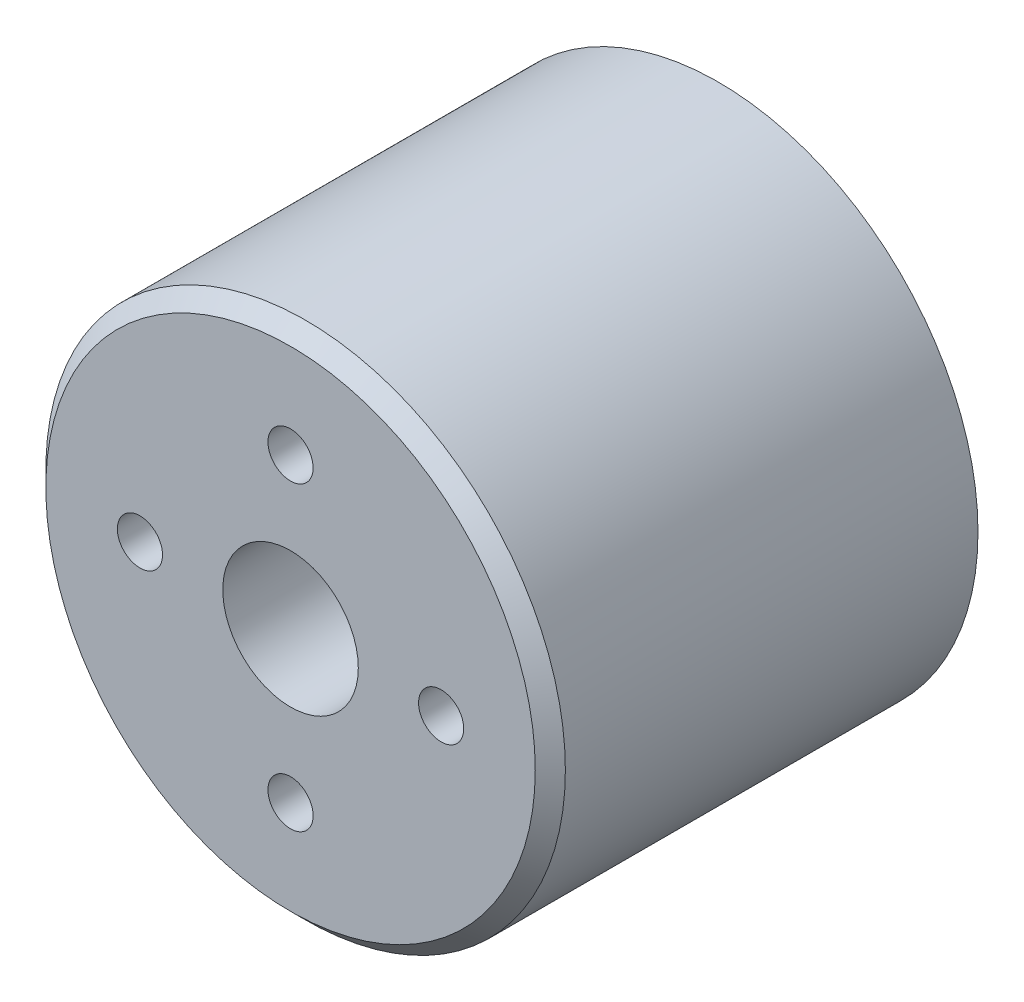
ISO-10303-21;
HEADER;
FILE_DESCRIPTION(('STEP AP214'),'2;1');
FILE_NAME('part.step','',(''),(''),'','','');
FILE_SCHEMA(('AUTOMOTIVE_DESIGN { 1 0 10303 214 1 1 1 1 }'));
ENDSEC;
DATA;
#1=APPLICATION_CONTEXT('core data for automotive mechanical design processes');
#2=APPLICATION_PROTOCOL_DEFINITION('international standard','automotive_design',2000,#1);
#3=PRODUCT_CONTEXT('',#1,'mechanical');
#4=PRODUCT('Part','Part','',(#3));
#5=PRODUCT_RELATED_PRODUCT_CATEGORY('part','',(#4));
#6=PRODUCT_DEFINITION_FORMATION('','',#4);
#7=PRODUCT_DEFINITION_CONTEXT('part definition',#1,'design');
#8=PRODUCT_DEFINITION('design','',#6,#7);
#9=PRODUCT_DEFINITION_SHAPE('','',#8);
#10=(LENGTH_UNIT() NAMED_UNIT(*) SI_UNIT(.MILLI.,.METRE.));
#11=(NAMED_UNIT(*) PLANE_ANGLE_UNIT() SI_UNIT($,.RADIAN.));
#12=(NAMED_UNIT(*) SI_UNIT($,.STERADIAN.) SOLID_ANGLE_UNIT());
#13=UNCERTAINTY_MEASURE_WITH_UNIT(LENGTH_MEASURE(1.E-05),#10,'distance_accuracy_value','');
#14=(GEOMETRIC_REPRESENTATION_CONTEXT(3) GLOBAL_UNCERTAINTY_ASSIGNED_CONTEXT((#13)) GLOBAL_UNIT_ASSIGNED_CONTEXT((#10,
#11,#12)) REPRESENTATION_CONTEXT('',''));
#15=CARTESIAN_POINT('',(0.,0.,0.));
#16=DIRECTION('',(0.,0.,1.));
#17=DIRECTION('',(1.,0.,0.));
#18=AXIS2_PLACEMENT_3D('',#15,#16,#17);
#19=CARTESIAN_POINT('',(0.,0.,28.4));
#20=DIRECTION('',(0.,0.,-1.));
#21=DIRECTION('',(-1.,0.,0.));
#22=AXIS2_PLACEMENT_3D('',#19,#20,#21);
#23=CYLINDRICAL_SURFACE('',#22,17.25);
#24=CARTESIAN_POINT('',(0.,0.,27.4));
#25=DIRECTION('',(0.,0.,1.));
#26=DIRECTION('',(1.,0.,0.));
#27=AXIS2_PLACEMENT_3D('',#24,#25,#26);
#28=CIRCLE('',#27,17.25);
#29=CARTESIAN_POINT('',(17.25,0.,27.4));
#30=VERTEX_POINT('',#29);
#31=EDGE_CURVE('E10',#30,#30,#28,.F.);
#32=ORIENTED_EDGE('',*,*,#31,.T.);
#33=EDGE_LOOP('',(#32));
#34=FACE_BOUND('',#33,.T.);
#35=CARTESIAN_POINT('',(0.,0.,0.));
#36=DIRECTION('',(0.,0.,1.));
#37=DIRECTION('',(1.,0.,0.));
#38=AXIS2_PLACEMENT_3D('',#35,#36,#37);
#39=CIRCLE('',#38,17.25);
#40=CARTESIAN_POINT('',(17.25,0.,0.));
#41=VERTEX_POINT('',#40);
#42=EDGE_CURVE('E45',#41,#41,#39,.T.);
#43=ORIENTED_EDGE('',*,*,#42,.T.);
#44=EDGE_LOOP('',(#43));
#45=FACE_BOUND('',#44,.T.);
#46=ADVANCED_FACE('F33',(#34,#45),#23,.T.);
#47=CARTESIAN_POINT('',(0.,0.,28.4));
#48=DIRECTION('',(0.,0.,1.));
#49=DIRECTION('',(1.,0.,0.));
#50=AXIS2_PLACEMENT_3D('',#47,#48,#49);
#51=PLANE('',#50);
#52=CARTESIAN_POINT('',(0.,0.,28.4));
#53=DIRECTION('',(0.,0.,1.));
#54=DIRECTION('',(1.,0.,0.));
#55=AXIS2_PLACEMENT_3D('',#52,#53,#54);
#56=CIRCLE('',#55,4.5);
#57=CARTESIAN_POINT('',(4.5,0.,28.4));
#58=VERTEX_POINT('',#57);
#59=EDGE_CURVE('E112',#58,#58,#56,.T.);
#60=ORIENTED_EDGE('',*,*,#59,.F.);
#61=EDGE_LOOP('',(#60));
#62=FACE_BOUND('',#61,.T.);
#63=CARTESIAN_POINT('',(0.,10.,28.4));
#64=DIRECTION('',(0.,0.,1.));
#65=DIRECTION('',(1.,0.,0.));
#66=AXIS2_PLACEMENT_3D('',#63,#64,#65);
#67=CIRCLE('',#66,1.5);
#68=CARTESIAN_POINT('',(1.5,10.,28.4));
#69=VERTEX_POINT('',#68);
#70=EDGE_CURVE('E107',#69,#69,#67,.T.);
#71=ORIENTED_EDGE('',*,*,#70,.F.);
#72=EDGE_LOOP('',(#71));
#73=FACE_BOUND('',#72,.T.);
#74=CARTESIAN_POINT('',(10.,0.,28.4));
#75=DIRECTION('',(0.,0.,1.));
#76=DIRECTION('',(1.,0.,0.));
#77=AXIS2_PLACEMENT_3D('',#74,#75,#76);
#78=CIRCLE('',#77,1.5);
#79=CARTESIAN_POINT('',(11.5,0.,28.4));
#80=VERTEX_POINT('',#79);
#81=EDGE_CURVE('E101',#80,#80,#78,.T.);
#82=ORIENTED_EDGE('',*,*,#81,.F.);
#83=EDGE_LOOP('',(#82));
#84=FACE_BOUND('',#83,.T.);
#85=CARTESIAN_POINT('',(0.,-10.,28.4));
#86=DIRECTION('',(0.,0.,1.));
#87=DIRECTION('',(1.,0.,0.));
#88=AXIS2_PLACEMENT_3D('',#85,#86,#87);
#89=CIRCLE('',#88,1.5);
#90=CARTESIAN_POINT('',(1.5,-10.,28.4));
#91=VERTEX_POINT('',#90);
#92=EDGE_CURVE('E95',#91,#91,#89,.T.);
#93=ORIENTED_EDGE('',*,*,#92,.F.);
#94=EDGE_LOOP('',(#93));
#95=FACE_BOUND('',#94,.T.);
#96=CARTESIAN_POINT('',(-10.,0.,28.4));
#97=DIRECTION('',(0.,0.,1.));
#98=DIRECTION('',(1.,0.,0.));
#99=AXIS2_PLACEMENT_3D('',#96,#97,#98);
#100=CIRCLE('',#99,1.5);
#101=CARTESIAN_POINT('',(-8.5,0.,28.4));
#102=VERTEX_POINT('',#101);
#103=EDGE_CURVE('E88',#102,#102,#100,.T.);
#104=ORIENTED_EDGE('',*,*,#103,.F.);
#105=EDGE_LOOP('',(#104));
#106=FACE_BOUND('',#105,.T.);
#107=CARTESIAN_POINT('',(0.,0.,28.4));
#108=DIRECTION('',(0.,0.,1.));
#109=DIRECTION('',(1.,0.,0.));
#110=AXIS2_PLACEMENT_3D('',#107,#108,#109);
#111=CIRCLE('',#110,16.25);
#112=CARTESIAN_POINT('',(16.25,0.,28.4));
#113=VERTEX_POINT('',#112);
#114=EDGE_CURVE('E41',#113,#113,#111,.T.);
#115=ORIENTED_EDGE('',*,*,#114,.T.);
#116=EDGE_LOOP('',(#115));
#117=FACE_BOUND('',#116,.T.);
#118=ADVANCED_FACE('F128',(#62,#73,#84,#95,#106,#117),#51,.T.);
#119=CARTESIAN_POINT('',(0.,0.,0.));
#120=DIRECTION('',(0.,0.,1.));
#121=DIRECTION('',(1.,0.,0.));
#122=AXIS2_PLACEMENT_3D('',#119,#120,#121);
#123=PLANE('',#122);
#124=CARTESIAN_POINT('',(0.,0.,0.));
#125=DIRECTION('',(0.,0.,1.));
#126=DIRECTION('',(1.,0.,0.));
#127=AXIS2_PLACEMENT_3D('',#124,#125,#126);
#128=CIRCLE('',#127,4.5);
#129=CARTESIAN_POINT('',(4.5,0.,0.));
#130=VERTEX_POINT('',#129);
#131=EDGE_CURVE('E92',#130,#130,#128,.T.);
#132=ORIENTED_EDGE('',*,*,#131,.T.);
#133=EDGE_LOOP('',(#132));
#134=FACE_BOUND('',#133,.T.);
#135=CARTESIAN_POINT('',(15.4264468641829,0.,0.));
#136=DIRECTION('',(0.,0.,-1.));
#137=DIRECTION('',(-1.,0.,0.));
#138=AXIS2_PLACEMENT_3D('',#135,#136,#137);
#139=CIRCLE('',#138,1.25);
#140=CARTESIAN_POINT('',(14.1764468641829,0.,0.));
#141=VERTEX_POINT('',#140);
#142=EDGE_CURVE('E58',#141,#141,#139,.T.);
#143=ORIENTED_EDGE('',*,*,#142,.F.);
#144=EDGE_LOOP('',(#143));
#145=FACE_BOUND('',#144,.T.);
#146=CARTESIAN_POINT('',(-7.71322343209146,-13.3596948745132,0.));
#147=DIRECTION('',(0.,0.,-1.));
#148=DIRECTION('',(-1.,0.,0.));
#149=AXIS2_PLACEMENT_3D('',#146,#147,#148);
#150=CIRCLE('',#149,1.25);
#151=CARTESIAN_POINT('',(-8.96322343209146,-13.3596948745132,0.));
#152=VERTEX_POINT('',#151);
#153=EDGE_CURVE('E65',#152,#152,#150,.T.);
#154=ORIENTED_EDGE('',*,*,#153,.F.);
#155=EDGE_LOOP('',(#154));
#156=FACE_BOUND('',#155,.T.);
#157=CARTESIAN_POINT('',(-7.71322343209146,13.3596948745132,0.));
#158=DIRECTION('',(0.,0.,-1.));
#159=DIRECTION('',(-1.,0.,0.));
#160=AXIS2_PLACEMENT_3D('',#157,#158,#159);
#161=CIRCLE('',#160,1.25);
#162=CARTESIAN_POINT('',(-8.96322343209146,13.3596948745132,0.));
#163=VERTEX_POINT('',#162);
#164=EDGE_CURVE('E71',#163,#163,#161,.T.);
#165=ORIENTED_EDGE('',*,*,#164,.F.);
#166=EDGE_LOOP('',(#165));
#167=FACE_BOUND('',#166,.T.);
#168=CARTESIAN_POINT('',(8.6602540378444,5.00000000000001,0.));
#169=DIRECTION('',(0.,0.,-1.));
#170=DIRECTION('',(-1.,0.,0.));
#171=AXIS2_PLACEMENT_3D('',#168,#169,#170);
#172=CIRCLE('',#171,1.5);
#173=CARTESIAN_POINT('',(7.1602540378444,5.00000000000001,0.));
#174=VERTEX_POINT('',#173);
#175=EDGE_CURVE('E77',#174,#174,#172,.T.);
#176=ORIENTED_EDGE('',*,*,#175,.F.);
#177=EDGE_LOOP('',(#176));
#178=FACE_BOUND('',#177,.T.);
#179=CARTESIAN_POINT('',(0.,-10.,0.));
#180=DIRECTION('',(0.,0.,-1.));
#181=DIRECTION('',(-1.,0.,0.));
#182=AXIS2_PLACEMENT_3D('',#179,#180,#181);
#183=CIRCLE('',#182,1.5);
#184=CARTESIAN_POINT('',(-1.5,-10.,0.));
#185=VERTEX_POINT('',#184);
#186=EDGE_CURVE('E83',#185,#185,#183,.T.);
#187=ORIENTED_EDGE('',*,*,#186,.F.);
#188=EDGE_LOOP('',(#187));
#189=FACE_BOUND('',#188,.T.);
#190=CARTESIAN_POINT('',(-8.6602540378444,5.00000000000001,0.));
#191=DIRECTION('',(0.,0.,-1.));
#192=DIRECTION('',(-1.,0.,0.));
#193=AXIS2_PLACEMENT_3D('',#190,#191,#192);
#194=CIRCLE('',#193,1.5);
#195=CARTESIAN_POINT('',(-10.1602540378444,5.00000000000001,0.));
#196=VERTEX_POINT('',#195);
#197=EDGE_CURVE('E52',#196,#196,#194,.T.);
#198=ORIENTED_EDGE('',*,*,#197,.F.);
#199=EDGE_LOOP('',(#198));
#200=FACE_BOUND('',#199,.T.);
#201=ORIENTED_EDGE('',*,*,#42,.F.);
#202=EDGE_LOOP('',(#201));
#203=FACE_BOUND('',#202,.T.);
#204=ADVANCED_FACE('F118',(#134,#145,#156,#167,#178,#189,#200,#203),#123,.F.);
#205=CARTESIAN_POINT('',(0.,0.,28.4));
#206=DIRECTION('',(0.,0.,-1.));
#207=DIRECTION('',(-1.,0.,0.));
#208=AXIS2_PLACEMENT_3D('',#205,#206,#207);
#209=CONICAL_SURFACE('',#208,16.25,0.785398163397452);
#210=ORIENTED_EDGE('',*,*,#31,.F.);
#211=EDGE_LOOP('',(#210));
#212=FACE_BOUND('',#211,.T.);
#213=ORIENTED_EDGE('',*,*,#114,.F.);
#214=EDGE_LOOP('',(#213));
#215=FACE_BOUND('',#214,.T.);
#216=ADVANCED_FACE('F36',(#212,#215),#209,.T.);
#217=CARTESIAN_POINT('',(-8.6602540378444,5.00000000000001,3.));
#218=DIRECTION('',(0.,0.,-1.));
#219=DIRECTION('',(-1.,0.,0.));
#220=AXIS2_PLACEMENT_3D('',#217,#218,#219);
#221=CYLINDRICAL_SURFACE('',#220,1.5);
#222=CARTESIAN_POINT('',(-8.6602540378444,5.00000000000001,3.));
#223=DIRECTION('',(0.,0.,-1.));
#224=DIRECTION('',(-1.,0.,0.));
#225=AXIS2_PLACEMENT_3D('',#222,#223,#224);
#226=CIRCLE('',#225,1.5);
#227=CARTESIAN_POINT('',(-10.1602540378444,5.00000000000001,3.));
#228=VERTEX_POINT('',#227);
#229=EDGE_CURVE('E49',#228,#228,#226,.T.);
#230=ORIENTED_EDGE('',*,*,#229,.F.);
#231=EDGE_LOOP('',(#230));
#232=FACE_BOUND('',#231,.T.);
#233=ORIENTED_EDGE('',*,*,#197,.T.);
#234=EDGE_LOOP('',(#233));
#235=FACE_BOUND('',#234,.T.);
#236=ADVANCED_FACE('F165',(#232,#235),#221,.F.);
#237=CARTESIAN_POINT('',(-8.6602540378444,5.00000000000001,3.));
#238=DIRECTION('',(0.,0.,-1.));
#239=DIRECTION('',(-1.,0.,0.));
#240=AXIS2_PLACEMENT_3D('',#237,#238,#239);
#241=PLANE('',#240);
#242=ORIENTED_EDGE('',*,*,#229,.T.);
#243=EDGE_LOOP('',(#242));
#244=FACE_BOUND('',#243,.T.);
#245=ADVANCED_FACE('F168',(#244),#241,.T.);
#246=CARTESIAN_POINT('',(0.,-10.,3.));
#247=DIRECTION('',(0.,0.,-1.));
#248=DIRECTION('',(-1.,0.,0.));
#249=AXIS2_PLACEMENT_3D('',#246,#247,#248);
#250=CYLINDRICAL_SURFACE('',#249,1.5);
#251=CARTESIAN_POINT('',(0.,-10.,3.));
#252=DIRECTION('',(0.,0.,-1.));
#253=DIRECTION('',(-1.,0.,0.));
#254=AXIS2_PLACEMENT_3D('',#251,#252,#253);
#255=CIRCLE('',#254,1.5);
#256=CARTESIAN_POINT('',(-1.5,-10.,3.));
#257=VERTEX_POINT('',#256);
#258=EDGE_CURVE('E55',#257,#257,#255,.T.);
#259=ORIENTED_EDGE('',*,*,#258,.F.);
#260=EDGE_LOOP('',(#259));
#261=FACE_BOUND('',#260,.T.);
#262=ORIENTED_EDGE('',*,*,#186,.T.);
#263=EDGE_LOOP('',(#262));
#264=FACE_BOUND('',#263,.T.);
#265=ADVANCED_FACE('F172',(#261,#264),#250,.F.);
#266=CARTESIAN_POINT('',(0.,-10.,3.));
#267=DIRECTION('',(0.,0.,-1.));
#268=DIRECTION('',(-1.,0.,0.));
#269=AXIS2_PLACEMENT_3D('',#266,#267,#268);
#270=PLANE('',#269);
#271=ORIENTED_EDGE('',*,*,#258,.T.);
#272=EDGE_LOOP('',(#271));
#273=FACE_BOUND('',#272,.T.);
#274=ADVANCED_FACE('F197',(#273),#270,.T.);
#275=CARTESIAN_POINT('',(8.6602540378444,5.00000000000001,3.));
#276=DIRECTION('',(0.,0.,-1.));
#277=DIRECTION('',(-1.,0.,0.));
#278=AXIS2_PLACEMENT_3D('',#275,#276,#277);
#279=CYLINDRICAL_SURFACE('',#278,1.5);
#280=CARTESIAN_POINT('',(8.6602540378444,5.00000000000001,3.));
#281=DIRECTION('',(0.,0.,-1.));
#282=DIRECTION('',(-1.,0.,0.));
#283=AXIS2_PLACEMENT_3D('',#280,#281,#282);
#284=CIRCLE('',#283,1.5);
#285=CARTESIAN_POINT('',(7.1602540378444,5.00000000000001,3.));
#286=VERTEX_POINT('',#285);
#287=EDGE_CURVE('E80',#286,#286,#284,.T.);
#288=ORIENTED_EDGE('',*,*,#287,.F.);
#289=EDGE_LOOP('',(#288));
#290=FACE_BOUND('',#289,.T.);
#291=ORIENTED_EDGE('',*,*,#175,.T.);
#292=EDGE_LOOP('',(#291));
#293=FACE_BOUND('',#292,.T.);
#294=ADVANCED_FACE('F194',(#290,#293),#279,.F.);
#295=CARTESIAN_POINT('',(8.6602540378444,5.00000000000001,3.));
#296=DIRECTION('',(0.,0.,-1.));
#297=DIRECTION('',(-1.,0.,0.));
#298=AXIS2_PLACEMENT_3D('',#295,#296,#297);
#299=PLANE('',#298);
#300=ORIENTED_EDGE('',*,*,#287,.T.);
#301=EDGE_LOOP('',(#300));
#302=FACE_BOUND('',#301,.T.);
#303=ADVANCED_FACE('F189',(#302),#299,.T.);
#304=CARTESIAN_POINT('',(-7.71322343209146,13.3596948745132,3.));
#305=DIRECTION('',(0.,0.,-1.));
#306=DIRECTION('',(-1.,0.,0.));
#307=AXIS2_PLACEMENT_3D('',#304,#305,#306);
#308=CYLINDRICAL_SURFACE('',#307,1.25);
#309=CARTESIAN_POINT('',(-7.71322343209146,13.3596948745132,3.));
#310=DIRECTION('',(0.,0.,-1.));
#311=DIRECTION('',(-1.,0.,0.));
#312=AXIS2_PLACEMENT_3D('',#309,#310,#311);
#313=CIRCLE('',#312,1.25);
#314=CARTESIAN_POINT('',(-8.96322343209146,13.3596948745132,3.));
#315=VERTEX_POINT('',#314);
#316=EDGE_CURVE('E74',#315,#315,#313,.T.);
#317=ORIENTED_EDGE('',*,*,#316,.F.);
#318=EDGE_LOOP('',(#317));
#319=FACE_BOUND('',#318,.T.);
#320=ORIENTED_EDGE('',*,*,#164,.T.);
#321=EDGE_LOOP('',(#320));
#322=FACE_BOUND('',#321,.T.);
#323=ADVANCED_FACE('F186',(#319,#322),#308,.F.);
#324=CARTESIAN_POINT('',(-7.71322343209146,13.3596948745132,3.));
#325=DIRECTION('',(0.,0.,-1.));
#326=DIRECTION('',(-1.,0.,0.));
#327=AXIS2_PLACEMENT_3D('',#324,#325,#326);
#328=PLANE('',#327);
#329=ORIENTED_EDGE('',*,*,#316,.T.);
#330=EDGE_LOOP('',(#329));
#331=FACE_BOUND('',#330,.T.);
#332=ADVANCED_FACE('F181',(#331),#328,.T.);
#333=CARTESIAN_POINT('',(-7.71322343209146,-13.3596948745132,3.));
#334=DIRECTION('',(0.,0.,-1.));
#335=DIRECTION('',(-1.,0.,0.));
#336=AXIS2_PLACEMENT_3D('',#333,#334,#335);
#337=CYLINDRICAL_SURFACE('',#336,1.25);
#338=CARTESIAN_POINT('',(-7.71322343209146,-13.3596948745132,3.));
#339=DIRECTION('',(0.,0.,-1.));
#340=DIRECTION('',(-1.,0.,0.));
#341=AXIS2_PLACEMENT_3D('',#338,#339,#340);
#342=CIRCLE('',#341,1.25);
#343=CARTESIAN_POINT('',(-8.96322343209146,-13.3596948745132,3.));
#344=VERTEX_POINT('',#343);
#345=EDGE_CURVE('E68',#344,#344,#342,.T.);
#346=ORIENTED_EDGE('',*,*,#345,.F.);
#347=EDGE_LOOP('',(#346));
#348=FACE_BOUND('',#347,.T.);
#349=ORIENTED_EDGE('',*,*,#153,.T.);
#350=EDGE_LOOP('',(#349));
#351=FACE_BOUND('',#350,.T.);
#352=ADVANCED_FACE('F178',(#348,#351),#337,.F.);
#353=CARTESIAN_POINT('',(-7.71322343209146,-13.3596948745132,3.));
#354=DIRECTION('',(0.,0.,-1.));
#355=DIRECTION('',(-1.,0.,0.));
#356=AXIS2_PLACEMENT_3D('',#353,#354,#355);
#357=PLANE('',#356);
#358=ORIENTED_EDGE('',*,*,#345,.T.);
#359=EDGE_LOOP('',(#358));
#360=FACE_BOUND('',#359,.T.);
#361=ADVANCED_FACE('F175',(#360),#357,.T.);
#362=CARTESIAN_POINT('',(15.4264468641829,0.,3.));
#363=DIRECTION('',(0.,0.,-1.));
#364=DIRECTION('',(-1.,0.,0.));
#365=AXIS2_PLACEMENT_3D('',#362,#363,#364);
#366=CYLINDRICAL_SURFACE('',#365,1.25);
#367=CARTESIAN_POINT('',(15.4264468641829,0.,3.));
#368=DIRECTION('',(0.,0.,-1.));
#369=DIRECTION('',(-1.,0.,0.));
#370=AXIS2_PLACEMENT_3D('',#367,#368,#369);
#371=CIRCLE('',#370,1.25);
#372=CARTESIAN_POINT('',(14.1764468641829,0.,3.));
#373=VERTEX_POINT('',#372);
#374=EDGE_CURVE('E61',#373,#373,#371,.T.);
#375=ORIENTED_EDGE('',*,*,#374,.F.);
#376=EDGE_LOOP('',(#375));
#377=FACE_BOUND('',#376,.T.);
#378=ORIENTED_EDGE('',*,*,#142,.T.);
#379=EDGE_LOOP('',(#378));
#380=FACE_BOUND('',#379,.T.);
#381=ADVANCED_FACE('F153',(#377,#380),#366,.F.);
#382=CARTESIAN_POINT('',(15.4264468641829,0.,3.));
#383=DIRECTION('',(0.,0.,-1.));
#384=DIRECTION('',(-1.,0.,0.));
#385=AXIS2_PLACEMENT_3D('',#382,#383,#384);
#386=PLANE('',#385);
#387=ORIENTED_EDGE('',*,*,#374,.T.);
#388=EDGE_LOOP('',(#387));
#389=FACE_BOUND('',#388,.T.);
#390=ADVANCED_FACE('F143',(#389),#386,.T.);
#391=CARTESIAN_POINT('',(-10.,0.,25.9));
#392=DIRECTION('',(0.,0.,1.));
#393=DIRECTION('',(1.,0.,0.));
#394=AXIS2_PLACEMENT_3D('',#391,#392,#393);
#395=CYLINDRICAL_SURFACE('',#394,1.5);
#396=CARTESIAN_POINT('',(-10.,0.,25.9));
#397=DIRECTION('',(0.,0.,1.));
#398=DIRECTION('',(1.,0.,0.));
#399=AXIS2_PLACEMENT_3D('',#396,#397,#398);
#400=CIRCLE('',#399,1.5);
#401=CARTESIAN_POINT('',(-8.5,0.,25.9));
#402=VERTEX_POINT('',#401);
#403=EDGE_CURVE('E91',#402,#402,#400,.T.);
#404=ORIENTED_EDGE('',*,*,#403,.F.);
#405=EDGE_LOOP('',(#404));
#406=FACE_BOUND('',#405,.T.);
#407=ORIENTED_EDGE('',*,*,#103,.T.);
#408=EDGE_LOOP('',(#407));
#409=FACE_BOUND('',#408,.T.);
#410=ADVANCED_FACE('F140',(#406,#409),#395,.F.);
#411=CARTESIAN_POINT('',(-10.,0.,25.9));
#412=DIRECTION('',(0.,0.,1.));
#413=DIRECTION('',(1.,0.,0.));
#414=AXIS2_PLACEMENT_3D('',#411,#412,#413);
#415=PLANE('',#414);
#416=ORIENTED_EDGE('',*,*,#403,.T.);
#417=EDGE_LOOP('',(#416));
#418=FACE_BOUND('',#417,.T.);
#419=ADVANCED_FACE('F142',(#418),#415,.T.);
#420=CARTESIAN_POINT('',(0.,-10.,25.9));
#421=DIRECTION('',(0.,0.,1.));
#422=DIRECTION('',(1.,0.,0.));
#423=AXIS2_PLACEMENT_3D('',#420,#421,#422);
#424=CYLINDRICAL_SURFACE('',#423,1.5);
#425=CARTESIAN_POINT('',(0.,-10.,25.9));
#426=DIRECTION('',(0.,0.,1.));
#427=DIRECTION('',(1.,0.,0.));
#428=AXIS2_PLACEMENT_3D('',#425,#426,#427);
#429=CIRCLE('',#428,1.5);
#430=CARTESIAN_POINT('',(1.5,-10.,25.9));
#431=VERTEX_POINT('',#430);
#432=EDGE_CURVE('E98',#431,#431,#429,.T.);
#433=ORIENTED_EDGE('',*,*,#432,.F.);
#434=EDGE_LOOP('',(#433));
#435=FACE_BOUND('',#434,.T.);
#436=ORIENTED_EDGE('',*,*,#92,.T.);
#437=EDGE_LOOP('',(#436));
#438=FACE_BOUND('',#437,.T.);
#439=ADVANCED_FACE('F150',(#435,#438),#424,.F.);
#440=CARTESIAN_POINT('',(0.,-10.,25.9));
#441=DIRECTION('',(0.,0.,1.));
#442=DIRECTION('',(1.,0.,0.));
#443=AXIS2_PLACEMENT_3D('',#440,#441,#442);
#444=PLANE('',#443);
#445=ORIENTED_EDGE('',*,*,#432,.T.);
#446=EDGE_LOOP('',(#445));
#447=FACE_BOUND('',#446,.T.);
#448=ADVANCED_FACE('F270',(#447),#444,.T.);
#449=CARTESIAN_POINT('',(10.,0.,25.9));
#450=DIRECTION('',(0.,0.,1.));
#451=DIRECTION('',(1.,0.,0.));
#452=AXIS2_PLACEMENT_3D('',#449,#450,#451);
#453=CYLINDRICAL_SURFACE('',#452,1.5);
#454=CARTESIAN_POINT('',(10.,0.,25.9));
#455=DIRECTION('',(0.,0.,1.));
#456=DIRECTION('',(1.,0.,0.));
#457=AXIS2_PLACEMENT_3D('',#454,#455,#456);
#458=CIRCLE('',#457,1.5);
#459=CARTESIAN_POINT('',(11.5,0.,25.9));
#460=VERTEX_POINT('',#459);
#461=EDGE_CURVE('E104',#460,#460,#458,.T.);
#462=ORIENTED_EDGE('',*,*,#461,.F.);
#463=EDGE_LOOP('',(#462));
#464=FACE_BOUND('',#463,.T.);
#465=ORIENTED_EDGE('',*,*,#81,.T.);
#466=EDGE_LOOP('',(#465));
#467=FACE_BOUND('',#466,.T.);
#468=ADVANCED_FACE('F280',(#464,#467),#453,.F.);
#469=CARTESIAN_POINT('',(10.,0.,25.9));
#470=DIRECTION('',(0.,0.,1.));
#471=DIRECTION('',(1.,0.,0.));
#472=AXIS2_PLACEMENT_3D('',#469,#470,#471);
#473=PLANE('',#472);
#474=ORIENTED_EDGE('',*,*,#461,.T.);
#475=EDGE_LOOP('',(#474));
#476=FACE_BOUND('',#475,.T.);
#477=ADVANCED_FACE('F290',(#476),#473,.T.);
#478=CARTESIAN_POINT('',(0.,10.,25.9));
#479=DIRECTION('',(0.,0.,1.));
#480=DIRECTION('',(1.,0.,0.));
#481=AXIS2_PLACEMENT_3D('',#478,#479,#480);
#482=CYLINDRICAL_SURFACE('',#481,1.5);
#483=CARTESIAN_POINT('',(0.,10.,25.9));
#484=DIRECTION('',(0.,0.,1.));
#485=DIRECTION('',(1.,0.,0.));
#486=AXIS2_PLACEMENT_3D('',#483,#484,#485);
#487=CIRCLE('',#486,1.5);
#488=CARTESIAN_POINT('',(1.5,10.,25.9));
#489=VERTEX_POINT('',#488);
#490=EDGE_CURVE('E62',#489,#489,#487,.T.);
#491=ORIENTED_EDGE('',*,*,#490,.F.);
#492=EDGE_LOOP('',(#491));
#493=FACE_BOUND('',#492,.T.);
#494=ORIENTED_EDGE('',*,*,#70,.T.);
#495=EDGE_LOOP('',(#494));
#496=FACE_BOUND('',#495,.T.);
#497=ADVANCED_FACE('F300',(#493,#496),#482,.F.);
#498=CARTESIAN_POINT('',(0.,10.,25.9));
#499=DIRECTION('',(0.,0.,1.));
#500=DIRECTION('',(1.,0.,0.));
#501=AXIS2_PLACEMENT_3D('',#498,#499,#500);
#502=PLANE('',#501);
#503=ORIENTED_EDGE('',*,*,#490,.T.);
#504=EDGE_LOOP('',(#503));
#505=FACE_BOUND('',#504,.T.);
#506=ADVANCED_FACE('F124',(#505),#502,.T.);
#507=CARTESIAN_POINT('',(0.,0.,0.));
#508=DIRECTION('',(0.,0.,1.));
#509=DIRECTION('',(1.,0.,0.));
#510=AXIS2_PLACEMENT_3D('',#507,#508,#509);
#511=CYLINDRICAL_SURFACE('',#510,4.5);
#512=ORIENTED_EDGE('',*,*,#131,.F.);
#513=EDGE_LOOP('',(#512));
#514=FACE_BOUND('',#513,.T.);
#515=ORIENTED_EDGE('',*,*,#59,.T.);
#516=EDGE_LOOP('',(#515));
#517=FACE_BOUND('',#516,.T.);
#518=ADVANCED_FACE('F121',(#514,#517),#511,.F.);
#519=CLOSED_SHELL('',(#46,#118,#204,#216,#236,#245,#265,#274,#294,#303,#323,#332,#352,#361,#381,
#390,#410,#419,#439,#448,#468,#477,#497,#506,#518));
#520=MANIFOLD_SOLID_BREP('B2',#519);
#521=ADVANCED_BREP_SHAPE_REPRESENTATION('',(#18,#520),#14);
#522=SHAPE_DEFINITION_REPRESENTATION(#9,#521);
ENDSEC;
END-ISO-10303-21;
